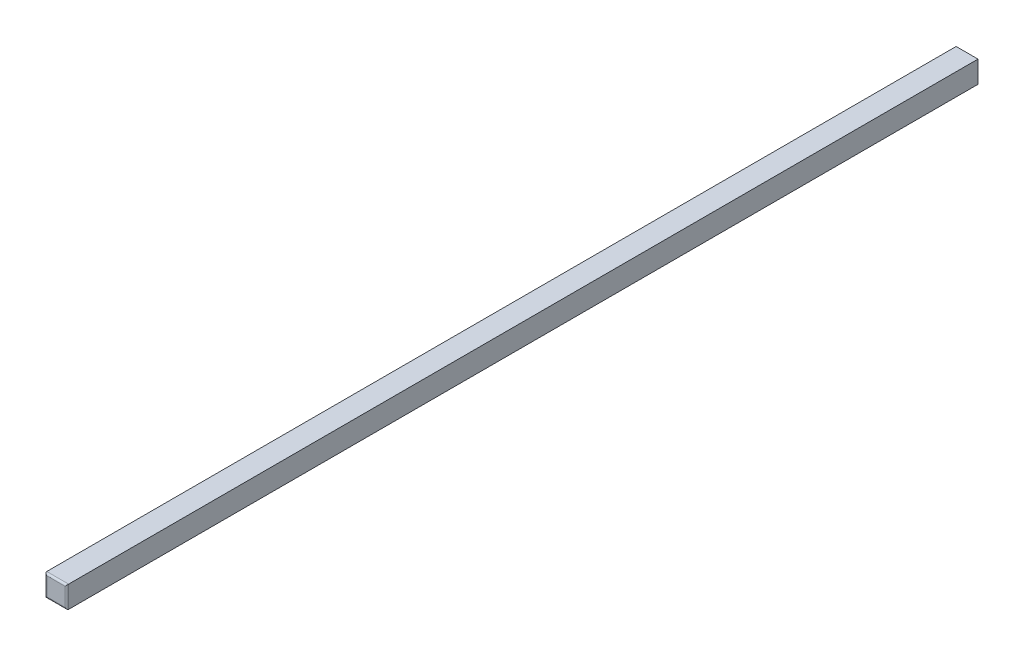
ISO-10303-21;
HEADER;
FILE_DESCRIPTION(('STEP AP214'),'2;1');
FILE_NAME('part.step','',(''),(''),'','','');
FILE_SCHEMA(('AUTOMOTIVE_DESIGN { 1 0 10303 214 1 1 1 1 }'));
ENDSEC;
DATA;
#1=APPLICATION_CONTEXT('core data for automotive mechanical design processes');
#2=APPLICATION_PROTOCOL_DEFINITION('international standard','automotive_design',2000,#1);
#3=PRODUCT_CONTEXT('',#1,'mechanical');
#4=PRODUCT('Part','Part','',(#3));
#5=PRODUCT_RELATED_PRODUCT_CATEGORY('part','',(#4));
#6=PRODUCT_DEFINITION_FORMATION('','',#4);
#7=PRODUCT_DEFINITION_CONTEXT('part definition',#1,'design');
#8=PRODUCT_DEFINITION('design','',#6,#7);
#9=PRODUCT_DEFINITION_SHAPE('','',#8);
#10=(LENGTH_UNIT() NAMED_UNIT(*) SI_UNIT(.MILLI.,.METRE.));
#11=(NAMED_UNIT(*) PLANE_ANGLE_UNIT() SI_UNIT($,.RADIAN.));
#12=(NAMED_UNIT(*) SI_UNIT($,.STERADIAN.) SOLID_ANGLE_UNIT());
#13=UNCERTAINTY_MEASURE_WITH_UNIT(LENGTH_MEASURE(1.E-05),#10,'distance_accuracy_value','');
#14=(GEOMETRIC_REPRESENTATION_CONTEXT(3) GLOBAL_UNCERTAINTY_ASSIGNED_CONTEXT((#13)) GLOBAL_UNIT_ASSIGNED_CONTEXT((#10,
#11,#12)) REPRESENTATION_CONTEXT('',''));
#15=CARTESIAN_POINT('',(0.,0.,0.));
#16=DIRECTION('',(0.,0.,1.));
#17=DIRECTION('',(1.,0.,0.));
#18=AXIS2_PLACEMENT_3D('',#15,#16,#17);
#19=CARTESIAN_POINT('',(-3.,-3.,125.));
#20=DIRECTION('',(1.,0.,0.));
#21=DIRECTION('',(0.,1.,0.));
#22=AXIS2_PLACEMENT_3D('',#19,#20,#21);
#23=PLANE('',#22);
#24=DIRECTION('',(0.,0.,-1.));
#25=VECTOR('',#24,1.);
#26=CARTESIAN_POINT('',(-3.,-3.,125.));
#27=LINE('',#26,#25);
#28=CARTESIAN_POINT('',(-3.,-3.,124.5));
#29=VERTEX_POINT('',#28);
#30=CARTESIAN_POINT('',(-3.,-3.,-125.));
#31=VERTEX_POINT('',#30);
#32=EDGE_CURVE('E93',#29,#31,#27,.T.);
#33=ORIENTED_EDGE('',*,*,#32,.F.);
#34=DIRECTION('',(0.,-1.,0.));
#35=VECTOR('',#34,1.);
#36=CARTESIAN_POINT('',(-3.,-3.,124.5));
#37=LINE('',#36,#35);
#38=CARTESIAN_POINT('',(-3.,3.,124.5));
#39=VERTEX_POINT('',#38);
#40=EDGE_CURVE('E151',#29,#39,#37,.F.);
#41=ORIENTED_EDGE('',*,*,#40,.T.);
#42=DIRECTION('',(0.,0.,-1.));
#43=VECTOR('',#42,1.);
#44=CARTESIAN_POINT('',(-3.,3.,125.));
#45=LINE('',#44,#43);
#46=CARTESIAN_POINT('',(-3.,3.,-125.));
#47=VERTEX_POINT('',#46);
#48=EDGE_CURVE('E115',#39,#47,#45,.T.);
#49=ORIENTED_EDGE('',*,*,#48,.T.);
#50=DIRECTION('',(0.,-1.,0.));
#51=VECTOR('',#50,1.);
#52=CARTESIAN_POINT('',(-3.,-3.,-125.));
#53=LINE('',#52,#51);
#54=EDGE_CURVE('E109',#47,#31,#53,.T.);
#55=ORIENTED_EDGE('',*,*,#54,.T.);
#56=EDGE_LOOP('',(#33,#41,#49,#55));
#57=FACE_BOUND('',#56,.T.);
#58=ADVANCED_FACE('F41',(#57),#23,.F.);
#59=CARTESIAN_POINT('',(3.,-3.,125.));
#60=DIRECTION('',(0.,1.,0.));
#61=DIRECTION('',(-1.,0.,0.));
#62=AXIS2_PLACEMENT_3D('',#59,#60,#61);
#63=PLANE('',#62);
#64=DIRECTION('',(0.,0.,-1.));
#65=VECTOR('',#64,1.);
#66=CARTESIAN_POINT('',(3.,-3.,125.));
#67=LINE('',#66,#65);
#68=CARTESIAN_POINT('',(3.,-3.,124.5));
#69=VERTEX_POINT('',#68);
#70=CARTESIAN_POINT('',(3.,-3.,-125.));
#71=VERTEX_POINT('',#70);
#72=EDGE_CURVE('E103',#69,#71,#67,.T.);
#73=ORIENTED_EDGE('',*,*,#72,.F.);
#74=DIRECTION('',(1.,0.,0.));
#75=VECTOR('',#74,1.);
#76=CARTESIAN_POINT('',(3.,-3.,124.5));
#77=LINE('',#76,#75);
#78=EDGE_CURVE('E11',#69,#29,#77,.F.);
#79=ORIENTED_EDGE('',*,*,#78,.T.);
#80=ORIENTED_EDGE('',*,*,#32,.T.);
#81=DIRECTION('',(1.,0.,0.));
#82=VECTOR('',#81,1.);
#83=CARTESIAN_POINT('',(3.,-3.,-125.));
#84=LINE('',#83,#82);
#85=EDGE_CURVE('E96',#31,#71,#84,.T.);
#86=ORIENTED_EDGE('',*,*,#85,.T.);
#87=EDGE_LOOP('',(#73,#79,#80,#86));
#88=FACE_BOUND('',#87,.T.);
#89=ADVANCED_FACE('F95',(#88),#63,.F.);
#90=CARTESIAN_POINT('',(3.,3.,125.));
#91=DIRECTION('',(-1.,0.,0.));
#92=DIRECTION('',(0.,-1.,0.));
#93=AXIS2_PLACEMENT_3D('',#90,#91,#92);
#94=PLANE('',#93);
#95=DIRECTION('',(0.,0.,-1.));
#96=VECTOR('',#95,1.);
#97=CARTESIAN_POINT('',(3.,3.,125.));
#98=LINE('',#97,#96);
#99=CARTESIAN_POINT('',(3.,3.,124.5));
#100=VERTEX_POINT('',#99);
#101=CARTESIAN_POINT('',(3.,3.,-125.));
#102=VERTEX_POINT('',#101);
#103=EDGE_CURVE('E130',#100,#102,#98,.T.);
#104=ORIENTED_EDGE('',*,*,#103,.F.);
#105=DIRECTION('',(0.,1.,0.));
#106=VECTOR('',#105,1.);
#107=CARTESIAN_POINT('',(3.,3.,124.5));
#108=LINE('',#107,#106);
#109=EDGE_CURVE('E51',#100,#69,#108,.F.);
#110=ORIENTED_EDGE('',*,*,#109,.T.);
#111=ORIENTED_EDGE('',*,*,#72,.T.);
#112=DIRECTION('',(0.,1.,0.));
#113=VECTOR('',#112,1.);
#114=CARTESIAN_POINT('',(3.,3.,-125.));
#115=LINE('',#114,#113);
#116=EDGE_CURVE('E111',#71,#102,#115,.T.);
#117=ORIENTED_EDGE('',*,*,#116,.T.);
#118=EDGE_LOOP('',(#104,#110,#111,#117));
#119=FACE_BOUND('',#118,.T.);
#120=ADVANCED_FACE('F181',(#119),#94,.F.);
#121=CARTESIAN_POINT('',(-3.,3.,125.));
#122=DIRECTION('',(0.,-1.,0.));
#123=DIRECTION('',(1.,0.,0.));
#124=AXIS2_PLACEMENT_3D('',#121,#122,#123);
#125=PLANE('',#124);
#126=ORIENTED_EDGE('',*,*,#48,.F.);
#127=DIRECTION('',(-1.,0.,0.));
#128=VECTOR('',#127,1.);
#129=CARTESIAN_POINT('',(-3.,3.,124.5));
#130=LINE('',#129,#128);
#131=EDGE_CURVE('E147',#39,#100,#130,.F.);
#132=ORIENTED_EDGE('',*,*,#131,.T.);
#133=ORIENTED_EDGE('',*,*,#103,.T.);
#134=DIRECTION('',(-1.,0.,0.));
#135=VECTOR('',#134,1.);
#136=CARTESIAN_POINT('',(-3.,3.,-125.));
#137=LINE('',#136,#135);
#138=EDGE_CURVE('E125',#102,#47,#137,.T.);
#139=ORIENTED_EDGE('',*,*,#138,.T.);
#140=EDGE_LOOP('',(#126,#132,#133,#139));
#141=FACE_BOUND('',#140,.T.);
#142=ADVANCED_FACE('F180',(#141),#125,.F.);
#143=CARTESIAN_POINT('',(0.,0.,125.));
#144=DIRECTION('',(0.,0.,-1.));
#145=DIRECTION('',(-1.,0.,0.));
#146=AXIS2_PLACEMENT_3D('',#143,#144,#145);
#147=PLANE('',#146);
#148=DIRECTION('',(0.,1.,0.));
#149=VECTOR('',#148,1.);
#150=CARTESIAN_POINT('',(2.5,0.,125.));
#151=LINE('',#150,#149);
#152=CARTESIAN_POINT('',(2.5,-2.5,125.));
#153=VERTEX_POINT('',#152);
#154=CARTESIAN_POINT('',(2.5,2.5,125.));
#155=VERTEX_POINT('',#154);
#156=EDGE_CURVE('E137',#153,#155,#151,.T.);
#157=ORIENTED_EDGE('',*,*,#156,.T.);
#158=DIRECTION('',(-1.,0.,0.));
#159=VECTOR('',#158,1.);
#160=CARTESIAN_POINT('',(0.,2.5,125.));
#161=LINE('',#160,#159);
#162=CARTESIAN_POINT('',(-2.5,2.5,125.));
#163=VERTEX_POINT('',#162);
#164=EDGE_CURVE('E143',#155,#163,#161,.T.);
#165=ORIENTED_EDGE('',*,*,#164,.T.);
#166=DIRECTION('',(0.,-1.,0.));
#167=VECTOR('',#166,1.);
#168=CARTESIAN_POINT('',(-2.5,0.,125.));
#169=LINE('',#168,#167);
#170=CARTESIAN_POINT('',(-2.5,-2.5,125.));
#171=VERTEX_POINT('',#170);
#172=EDGE_CURVE('E140',#163,#171,#169,.T.);
#173=ORIENTED_EDGE('',*,*,#172,.T.);
#174=DIRECTION('',(1.,0.,0.));
#175=VECTOR('',#174,1.);
#176=CARTESIAN_POINT('',(0.,-2.5,125.));
#177=LINE('',#176,#175);
#178=EDGE_CURVE('E102',#171,#153,#177,.T.);
#179=ORIENTED_EDGE('',*,*,#178,.T.);
#180=EDGE_LOOP('',(#157,#165,#173,#179));
#181=FACE_BOUND('',#180,.T.);
#182=ADVANCED_FACE('F173',(#181),#147,.F.);
#183=CARTESIAN_POINT('',(0.,0.,-125.));
#184=DIRECTION('',(0.,0.,-1.));
#185=DIRECTION('',(-1.,0.,0.));
#186=AXIS2_PLACEMENT_3D('',#183,#184,#185);
#187=PLANE('',#186);
#188=ORIENTED_EDGE('',*,*,#54,.F.);
#189=ORIENTED_EDGE('',*,*,#138,.F.);
#190=ORIENTED_EDGE('',*,*,#116,.F.);
#191=ORIENTED_EDGE('',*,*,#85,.F.);
#192=EDGE_LOOP('',(#188,#189,#190,#191));
#193=FACE_BOUND('',#192,.T.);
#194=ADVANCED_FACE('F107',(#193),#187,.T.);
#195=CARTESIAN_POINT('',(0.,-2.5,124.5));
#196=DIRECTION('',(1.,0.,0.));
#197=DIRECTION('',(0.,1.,0.));
#198=AXIS2_PLACEMENT_3D('',#195,#196,#197);
#199=CYLINDRICAL_SURFACE('',#198,0.5);
#200=CARTESIAN_POINT('',(-2.5,-2.5,124.5));
#201=DIRECTION('',(0.707106781186548,-0.707106781186547,0.));
#202=DIRECTION('',(0.707106781186547,0.707106781186548,0.));
#203=AXIS2_PLACEMENT_3D('',#200,#201,#202);
#204=ELLIPSE('',#203,0.707106781186547,0.5);
#205=EDGE_CURVE('E121',#29,#171,#204,.F.);
#206=ORIENTED_EDGE('',*,*,#205,.F.);
#207=ORIENTED_EDGE('',*,*,#78,.F.);
#208=CARTESIAN_POINT('',(2.5,-2.5,124.5));
#209=DIRECTION('',(0.707106781186547,0.707106781186548,0.));
#210=DIRECTION('',(0.707106781186548,-0.707106781186547,0.));
#211=AXIS2_PLACEMENT_3D('',#208,#209,#210);
#212=ELLIPSE('',#211,0.707106781186547,0.5);
#213=EDGE_CURVE('E45',#153,#69,#212,.T.);
#214=ORIENTED_EDGE('',*,*,#213,.F.);
#215=ORIENTED_EDGE('',*,*,#178,.F.);
#216=EDGE_LOOP('',(#206,#207,#214,#215));
#217=FACE_BOUND('',#216,.T.);
#218=ADVANCED_FACE('F43',(#217),#199,.T.);
#219=CARTESIAN_POINT('',(2.5,0.,124.5));
#220=DIRECTION('',(0.,1.,0.));
#221=DIRECTION('',(-1.,0.,0.));
#222=AXIS2_PLACEMENT_3D('',#219,#220,#221);
#223=CYLINDRICAL_SURFACE('',#222,0.5);
#224=ORIENTED_EDGE('',*,*,#213,.T.);
#225=ORIENTED_EDGE('',*,*,#109,.F.);
#226=CARTESIAN_POINT('',(2.5,2.5,124.5));
#227=DIRECTION('',(-0.707106781186548,0.707106781186547,0.));
#228=DIRECTION('',(0.707106781186547,0.707106781186548,0.));
#229=AXIS2_PLACEMENT_3D('',#226,#227,#228);
#230=ELLIPSE('',#229,0.707106781186548,0.5);
#231=EDGE_CURVE('E159',#155,#100,#230,.T.);
#232=ORIENTED_EDGE('',*,*,#231,.F.);
#233=ORIENTED_EDGE('',*,*,#156,.F.);
#234=EDGE_LOOP('',(#224,#225,#232,#233));
#235=FACE_BOUND('',#234,.T.);
#236=ADVANCED_FACE('F198',(#235),#223,.T.);
#237=CARTESIAN_POINT('',(-2.5,0.,124.5));
#238=DIRECTION('',(0.,-1.,0.));
#239=DIRECTION('',(1.,0.,0.));
#240=AXIS2_PLACEMENT_3D('',#237,#238,#239);
#241=CYLINDRICAL_SURFACE('',#240,0.5);
#242=ORIENTED_EDGE('',*,*,#205,.T.);
#243=ORIENTED_EDGE('',*,*,#172,.F.);
#244=CARTESIAN_POINT('',(-2.5,2.5,124.5));
#245=DIRECTION('',(-0.707106781186547,-0.707106781186548,0.));
#246=DIRECTION('',(0.707106781186548,-0.707106781186547,0.));
#247=AXIS2_PLACEMENT_3D('',#244,#245,#246);
#248=ELLIPSE('',#247,0.707106781186547,0.5);
#249=EDGE_CURVE('E156',#39,#163,#248,.F.);
#250=ORIENTED_EDGE('',*,*,#249,.F.);
#251=ORIENTED_EDGE('',*,*,#40,.F.);
#252=EDGE_LOOP('',(#242,#243,#250,#251));
#253=FACE_BOUND('',#252,.T.);
#254=ADVANCED_FACE('F166',(#253),#241,.T.);
#255=CARTESIAN_POINT('',(0.,2.5,124.5));
#256=DIRECTION('',(-1.,0.,0.));
#257=DIRECTION('',(0.,-1.,0.));
#258=AXIS2_PLACEMENT_3D('',#255,#256,#257);
#259=CYLINDRICAL_SURFACE('',#258,0.5);
#260=ORIENTED_EDGE('',*,*,#231,.T.);
#261=ORIENTED_EDGE('',*,*,#131,.F.);
#262=ORIENTED_EDGE('',*,*,#249,.T.);
#263=ORIENTED_EDGE('',*,*,#164,.F.);
#264=EDGE_LOOP('',(#260,#261,#262,#263));
#265=FACE_BOUND('',#264,.T.);
#266=ADVANCED_FACE('F177',(#265),#259,.T.);
#267=CLOSED_SHELL('',(#58,#89,#120,#142,#182,#194,#218,#236,#254,#266));
#268=MANIFOLD_SOLID_BREP('B2',#267);
#269=ADVANCED_BREP_SHAPE_REPRESENTATION('',(#18,#268),#14);
#270=SHAPE_DEFINITION_REPRESENTATION(#9,#269);
ENDSEC;
END-ISO-10303-21;
